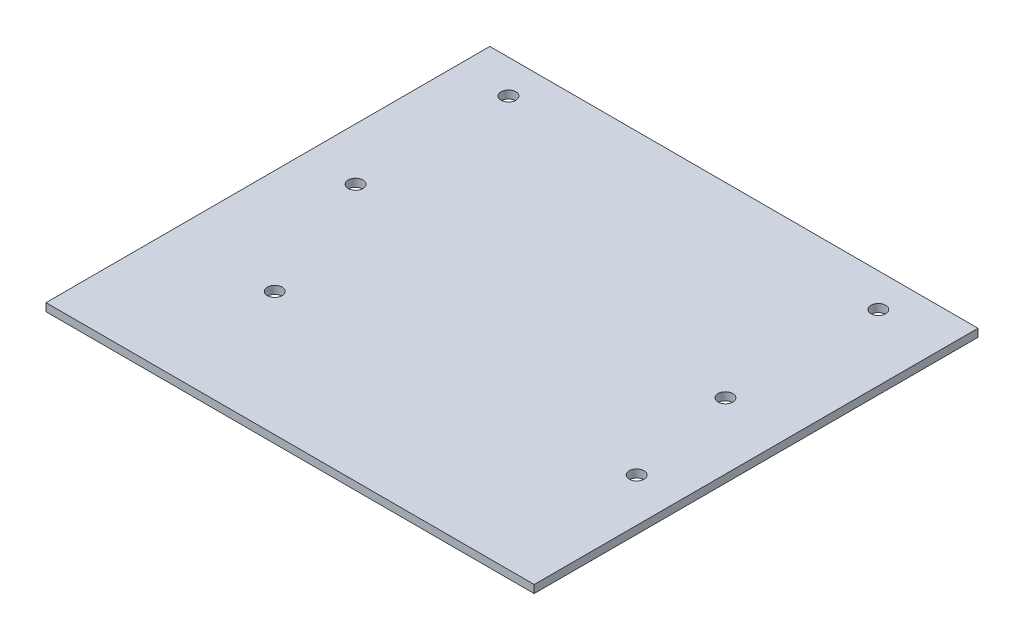
ISO-10303-21;
HEADER;
FILE_DESCRIPTION(('STEP AP214'),'2;1');
FILE_NAME('part.step','',(''),(''),'','','');
FILE_SCHEMA(('AUTOMOTIVE_DESIGN { 1 0 10303 214 1 1 1 1 }'));
ENDSEC;
DATA;
#1=APPLICATION_CONTEXT('core data for automotive mechanical design processes');
#2=APPLICATION_PROTOCOL_DEFINITION('international standard','automotive_design',2000,#1);
#3=PRODUCT_CONTEXT('',#1,'mechanical');
#4=PRODUCT('Part','Part','',(#3));
#5=PRODUCT_RELATED_PRODUCT_CATEGORY('part','',(#4));
#6=PRODUCT_DEFINITION_FORMATION('','',#4);
#7=PRODUCT_DEFINITION_CONTEXT('part definition',#1,'design');
#8=PRODUCT_DEFINITION('design','',#6,#7);
#9=PRODUCT_DEFINITION_SHAPE('','',#8);
#10=(LENGTH_UNIT() NAMED_UNIT(*) SI_UNIT(.MILLI.,.METRE.));
#11=(NAMED_UNIT(*) PLANE_ANGLE_UNIT() SI_UNIT($,.RADIAN.));
#12=(NAMED_UNIT(*) SI_UNIT($,.STERADIAN.) SOLID_ANGLE_UNIT());
#13=UNCERTAINTY_MEASURE_WITH_UNIT(LENGTH_MEASURE(1.E-05),#10,'distance_accuracy_value','');
#14=(GEOMETRIC_REPRESENTATION_CONTEXT(3) GLOBAL_UNCERTAINTY_ASSIGNED_CONTEXT((#13)) GLOBAL_UNIT_ASSIGNED_CONTEXT((#10,
#11,#12)) REPRESENTATION_CONTEXT('',''));
#15=CARTESIAN_POINT('',(0.,0.,0.));
#16=DIRECTION('',(0.,0.,1.));
#17=DIRECTION('',(1.,0.,0.));
#18=AXIS2_PLACEMENT_3D('',#15,#16,#17);
#19=CARTESIAN_POINT('',(0.,1.6,0.));
#20=DIRECTION('',(0.,-1.,0.));
#21=DIRECTION('',(0.,0.,-1.));
#22=AXIS2_PLACEMENT_3D('',#19,#20,#21);
#23=PLANE('',#22);
#24=DIRECTION('',(0.,0.,1.));
#25=VECTOR('',#24,1.);
#26=CARTESIAN_POINT('',(0.,1.6,0.));
#27=LINE('',#26,#25);
#28=CARTESIAN_POINT('',(0.,1.6,-90.));
#29=VERTEX_POINT('',#28);
#30=CARTESIAN_POINT('',(0.,1.6,0.));
#31=VERTEX_POINT('',#30);
#32=EDGE_CURVE('E87',#29,#31,#27,.T.);
#33=ORIENTED_EDGE('',*,*,#32,.T.);
#34=DIRECTION('',(1.,0.,0.));
#35=VECTOR('',#34,1.);
#36=CARTESIAN_POINT('',(0.,1.6,0.));
#37=LINE('',#36,#35);
#38=CARTESIAN_POINT('',(99.,1.6,0.));
#39=VERTEX_POINT('',#38);
#40=EDGE_CURVE('E82',#31,#39,#37,.T.);
#41=ORIENTED_EDGE('',*,*,#40,.T.);
#42=DIRECTION('',(0.,0.,-1.));
#43=VECTOR('',#42,1.);
#44=CARTESIAN_POINT('',(99.,1.6,0.));
#45=LINE('',#44,#43);
#46=CARTESIAN_POINT('',(99.,1.6,-90.));
#47=VERTEX_POINT('',#46);
#48=EDGE_CURVE('E85',#39,#47,#45,.T.);
#49=ORIENTED_EDGE('',*,*,#48,.T.);
#50=DIRECTION('',(-1.,0.,0.));
#51=VECTOR('',#50,1.);
#52=CARTESIAN_POINT('',(0.,1.6,-90.));
#53=LINE('',#52,#51);
#54=EDGE_CURVE('E52',#47,#29,#53,.T.);
#55=ORIENTED_EDGE('',*,*,#54,.T.);
#56=EDGE_LOOP('',(#33,#41,#49,#55));
#57=FACE_BOUND('',#56,.T.);
#58=CARTESIAN_POINT('',(10.5995733333333,1.6,-83.1801861351435));
#59=DIRECTION('',(0.,1.,0.));
#60=DIRECTION('',(0.,0.,1.));
#61=AXIS2_PLACEMENT_3D('',#58,#59,#60);
#62=CIRCLE('',#61,1.5);
#63=CARTESIAN_POINT('',(10.5995733333333,1.6,-81.6801861351435));
#64=VERTEX_POINT('',#63);
#65=EDGE_CURVE('E102',#64,#64,#62,.T.);
#66=ORIENTED_EDGE('',*,*,#65,.F.);
#67=EDGE_LOOP('',(#66));
#68=FACE_BOUND('',#67,.T.);
#69=CARTESIAN_POINT('',(85.5995733333333,1.6,-83.1801861351435));
#70=DIRECTION('',(0.,1.,0.));
#71=DIRECTION('',(0.,0.,1.));
#72=AXIS2_PLACEMENT_3D('',#69,#70,#71);
#73=CIRCLE('',#72,1.5);
#74=CARTESIAN_POINT('',(85.5995733333333,1.6,-81.6801861351435));
#75=VERTEX_POINT('',#74);
#76=EDGE_CURVE('E117',#75,#75,#73,.T.);
#77=ORIENTED_EDGE('',*,*,#76,.F.);
#78=EDGE_LOOP('',(#77));
#79=FACE_BOUND('',#78,.T.);
#80=CARTESIAN_POINT('',(10.5995733333333,1.6,-52.1801861351435));
#81=DIRECTION('',(0.,1.,0.));
#82=DIRECTION('',(0.,0.,1.));
#83=AXIS2_PLACEMENT_3D('',#80,#81,#82);
#84=CIRCLE('',#83,1.5);
#85=CARTESIAN_POINT('',(10.5995733333333,1.6,-50.6801861351435));
#86=VERTEX_POINT('',#85);
#87=EDGE_CURVE('E123',#86,#86,#84,.T.);
#88=ORIENTED_EDGE('',*,*,#87,.F.);
#89=EDGE_LOOP('',(#88));
#90=FACE_BOUND('',#89,.T.);
#91=CARTESIAN_POINT('',(85.5995733333333,1.6,-52.1801861351435));
#92=DIRECTION('',(0.,1.,0.));
#93=DIRECTION('',(0.,0.,1.));
#94=AXIS2_PLACEMENT_3D('',#91,#92,#93);
#95=CIRCLE('',#94,1.5);
#96=CARTESIAN_POINT('',(85.5995733333333,1.6,-50.6801861351435));
#97=VERTEX_POINT('',#96);
#98=EDGE_CURVE('E129',#97,#97,#95,.T.);
#99=ORIENTED_EDGE('',*,*,#98,.F.);
#100=EDGE_LOOP('',(#99));
#101=FACE_BOUND('',#100,.T.);
#102=CARTESIAN_POINT('',(21.2194612407166,1.6,-25.1699564094523));
#103=DIRECTION('',(0.,1.,0.));
#104=DIRECTION('',(0.,0.,1.));
#105=AXIS2_PLACEMENT_3D('',#102,#103,#104);
#106=CIRCLE('',#105,1.5);
#107=CARTESIAN_POINT('',(21.2194612407166,1.6,-23.6699564094523));
#108=VERTEX_POINT('',#107);
#109=EDGE_CURVE('E135',#108,#108,#106,.T.);
#110=ORIENTED_EDGE('',*,*,#109,.F.);
#111=EDGE_LOOP('',(#110));
#112=FACE_BOUND('',#111,.T.);
#113=CARTESIAN_POINT('',(90.1538087845677,1.6,-29.622324790266));
#114=DIRECTION('',(0.,1.,0.));
#115=DIRECTION('',(0.,0.,1.));
#116=AXIS2_PLACEMENT_3D('',#113,#114,#115);
#117=CIRCLE('',#116,1.5);
#118=CARTESIAN_POINT('',(90.1538087845677,1.6,-28.122324790266));
#119=VERTEX_POINT('',#118);
#120=EDGE_CURVE('E141',#119,#119,#117,.T.);
#121=ORIENTED_EDGE('',*,*,#120,.F.);
#122=EDGE_LOOP('',(#121));
#123=FACE_BOUND('',#122,.T.);
#124=ADVANCED_FACE('F35',(#57,#68,#79,#90,#101,#112,#123),#23,.F.);
#125=CARTESIAN_POINT('',(0.,0.,0.));
#126=DIRECTION('',(0.,-1.,0.));
#127=DIRECTION('',(0.,0.,-1.));
#128=AXIS2_PLACEMENT_3D('',#125,#126,#127);
#129=PLANE('',#128);
#130=CARTESIAN_POINT('',(21.2194612407166,0.,-25.1699564094523));
#131=DIRECTION('',(0.,1.,0.));
#132=DIRECTION('',(0.,0.,1.));
#133=AXIS2_PLACEMENT_3D('',#130,#131,#132);
#134=CIRCLE('',#133,1.5);
#135=CARTESIAN_POINT('',(21.2194612407166,0.,-23.6699564094523));
#136=VERTEX_POINT('',#135);
#137=EDGE_CURVE('E138',#136,#136,#134,.T.);
#138=ORIENTED_EDGE('',*,*,#137,.T.);
#139=EDGE_LOOP('',(#138));
#140=FACE_BOUND('',#139,.T.);
#141=CARTESIAN_POINT('',(10.5995733333333,0.,-52.1801861351435));
#142=DIRECTION('',(0.,1.,0.));
#143=DIRECTION('',(0.,0.,1.));
#144=AXIS2_PLACEMENT_3D('',#141,#142,#143);
#145=CIRCLE('',#144,1.5);
#146=CARTESIAN_POINT('',(10.5995733333333,0.,-50.6801861351435));
#147=VERTEX_POINT('',#146);
#148=EDGE_CURVE('E126',#147,#147,#145,.T.);
#149=ORIENTED_EDGE('',*,*,#148,.T.);
#150=EDGE_LOOP('',(#149));
#151=FACE_BOUND('',#150,.T.);
#152=CARTESIAN_POINT('',(10.5995733333333,0.,-83.1801861351435));
#153=DIRECTION('',(0.,1.,0.));
#154=DIRECTION('',(0.,0.,1.));
#155=AXIS2_PLACEMENT_3D('',#152,#153,#154);
#156=CIRCLE('',#155,1.5);
#157=CARTESIAN_POINT('',(10.5995733333333,0.,-81.6801861351435));
#158=VERTEX_POINT('',#157);
#159=EDGE_CURVE('E114',#158,#158,#156,.T.);
#160=ORIENTED_EDGE('',*,*,#159,.T.);
#161=EDGE_LOOP('',(#160));
#162=FACE_BOUND('',#161,.T.);
#163=DIRECTION('',(0.,0.,1.));
#164=VECTOR('',#163,1.);
#165=CARTESIAN_POINT('',(0.,0.,0.));
#166=LINE('',#165,#164);
#167=CARTESIAN_POINT('',(0.,0.,-90.));
#168=VERTEX_POINT('',#167);
#169=CARTESIAN_POINT('',(0.,0.,0.));
#170=VERTEX_POINT('',#169);
#171=EDGE_CURVE('E99',#168,#170,#166,.T.);
#172=ORIENTED_EDGE('',*,*,#171,.F.);
#173=DIRECTION('',(-1.,0.,0.));
#174=VECTOR('',#173,1.);
#175=CARTESIAN_POINT('',(0.,0.,-90.));
#176=LINE('',#175,#174);
#177=CARTESIAN_POINT('',(99.,0.,-90.));
#178=VERTEX_POINT('',#177);
#179=EDGE_CURVE('E75',#178,#168,#176,.T.);
#180=ORIENTED_EDGE('',*,*,#179,.F.);
#181=DIRECTION('',(0.,0.,-1.));
#182=VECTOR('',#181,1.);
#183=CARTESIAN_POINT('',(99.,0.,0.));
#184=LINE('',#183,#182);
#185=CARTESIAN_POINT('',(99.,0.,0.));
#186=VERTEX_POINT('',#185);
#187=EDGE_CURVE('E69',#186,#178,#184,.T.);
#188=ORIENTED_EDGE('',*,*,#187,.F.);
#189=DIRECTION('',(1.,0.,0.));
#190=VECTOR('',#189,1.);
#191=CARTESIAN_POINT('',(0.,0.,0.));
#192=LINE('',#191,#190);
#193=EDGE_CURVE('E91',#170,#186,#192,.T.);
#194=ORIENTED_EDGE('',*,*,#193,.F.);
#195=EDGE_LOOP('',(#172,#180,#188,#194));
#196=FACE_BOUND('',#195,.T.);
#197=CARTESIAN_POINT('',(85.5995733333333,0.,-83.1801861351435));
#198=DIRECTION('',(0.,1.,0.));
#199=DIRECTION('',(0.,0.,1.));
#200=AXIS2_PLACEMENT_3D('',#197,#198,#199);
#201=CIRCLE('',#200,1.5);
#202=CARTESIAN_POINT('',(85.5995733333333,0.,-81.6801861351435));
#203=VERTEX_POINT('',#202);
#204=EDGE_CURVE('E120',#203,#203,#201,.T.);
#205=ORIENTED_EDGE('',*,*,#204,.T.);
#206=EDGE_LOOP('',(#205));
#207=FACE_BOUND('',#206,.T.);
#208=CARTESIAN_POINT('',(85.5995733333333,0.,-52.1801861351435));
#209=DIRECTION('',(0.,1.,0.));
#210=DIRECTION('',(0.,0.,1.));
#211=AXIS2_PLACEMENT_3D('',#208,#209,#210);
#212=CIRCLE('',#211,1.5);
#213=CARTESIAN_POINT('',(85.5995733333333,0.,-50.6801861351435));
#214=VERTEX_POINT('',#213);
#215=EDGE_CURVE('E132',#214,#214,#212,.T.);
#216=ORIENTED_EDGE('',*,*,#215,.T.);
#217=EDGE_LOOP('',(#216));
#218=FACE_BOUND('',#217,.T.);
#219=CARTESIAN_POINT('',(90.1538087845677,0.,-29.622324790266));
#220=DIRECTION('',(0.,1.,0.));
#221=DIRECTION('',(0.,0.,1.));
#222=AXIS2_PLACEMENT_3D('',#219,#220,#221);
#223=CIRCLE('',#222,1.5);
#224=CARTESIAN_POINT('',(90.1538087845677,0.,-28.122324790266));
#225=VERTEX_POINT('',#224);
#226=EDGE_CURVE('E144',#225,#225,#223,.T.);
#227=ORIENTED_EDGE('',*,*,#226,.T.);
#228=EDGE_LOOP('',(#227));
#229=FACE_BOUND('',#228,.T.);
#230=ADVANCED_FACE('F110',(#140,#151,#162,#196,#207,#218,#229),#129,.T.);
#231=CARTESIAN_POINT('',(0.,1.6,0.));
#232=DIRECTION('',(1.,0.,0.));
#233=DIRECTION('',(0.,0.,-1.));
#234=AXIS2_PLACEMENT_3D('',#231,#232,#233);
#235=PLANE('',#234);
#236=ORIENTED_EDGE('',*,*,#171,.T.);
#237=DIRECTION('',(0.,-1.,0.));
#238=VECTOR('',#237,1.);
#239=CARTESIAN_POINT('',(0.,1.6,0.));
#240=LINE('',#239,#238);
#241=EDGE_CURVE('E11',#31,#170,#240,.T.);
#242=ORIENTED_EDGE('',*,*,#241,.F.);
#243=ORIENTED_EDGE('',*,*,#32,.F.);
#244=DIRECTION('',(0.,-1.,0.));
#245=VECTOR('',#244,1.);
#246=CARTESIAN_POINT('',(0.,1.6,-90.));
#247=LINE('',#246,#245);
#248=EDGE_CURVE('E95',#29,#168,#247,.T.);
#249=ORIENTED_EDGE('',*,*,#248,.T.);
#250=EDGE_LOOP('',(#236,#242,#243,#249));
#251=FACE_BOUND('',#250,.T.);
#252=ADVANCED_FACE('F37',(#251),#235,.F.);
#253=CARTESIAN_POINT('',(0.,1.6,0.));
#254=DIRECTION('',(0.,0.,-1.));
#255=DIRECTION('',(-1.,0.,0.));
#256=AXIS2_PLACEMENT_3D('',#253,#254,#255);
#257=PLANE('',#256);
#258=ORIENTED_EDGE('',*,*,#193,.T.);
#259=DIRECTION('',(0.,-1.,0.));
#260=VECTOR('',#259,1.);
#261=CARTESIAN_POINT('',(99.,1.6,0.));
#262=LINE('',#261,#260);
#263=EDGE_CURVE('E44',#39,#186,#262,.T.);
#264=ORIENTED_EDGE('',*,*,#263,.F.);
#265=ORIENTED_EDGE('',*,*,#40,.F.);
#266=ORIENTED_EDGE('',*,*,#241,.T.);
#267=EDGE_LOOP('',(#258,#264,#265,#266));
#268=FACE_BOUND('',#267,.T.);
#269=ADVANCED_FACE('F90',(#268),#257,.F.);
#270=CARTESIAN_POINT('',(99.,1.6,0.));
#271=DIRECTION('',(-1.,0.,0.));
#272=DIRECTION('',(0.,0.,1.));
#273=AXIS2_PLACEMENT_3D('',#270,#271,#272);
#274=PLANE('',#273);
#275=ORIENTED_EDGE('',*,*,#187,.T.);
#276=DIRECTION('',(0.,-1.,0.));
#277=VECTOR('',#276,1.);
#278=CARTESIAN_POINT('',(99.,1.6,-90.));
#279=LINE('',#278,#277);
#280=EDGE_CURVE('E92',#47,#178,#279,.T.);
#281=ORIENTED_EDGE('',*,*,#280,.F.);
#282=ORIENTED_EDGE('',*,*,#48,.F.);
#283=ORIENTED_EDGE('',*,*,#263,.T.);
#284=EDGE_LOOP('',(#275,#281,#282,#283));
#285=FACE_BOUND('',#284,.T.);
#286=ADVANCED_FACE('F93',(#285),#274,.F.);
#287=CARTESIAN_POINT('',(0.,1.6,-90.));
#288=DIRECTION('',(0.,0.,1.));
#289=DIRECTION('',(1.,0.,0.));
#290=AXIS2_PLACEMENT_3D('',#287,#288,#289);
#291=PLANE('',#290);
#292=ORIENTED_EDGE('',*,*,#179,.T.);
#293=ORIENTED_EDGE('',*,*,#248,.F.);
#294=ORIENTED_EDGE('',*,*,#54,.F.);
#295=ORIENTED_EDGE('',*,*,#280,.T.);
#296=EDGE_LOOP('',(#292,#293,#294,#295));
#297=FACE_BOUND('',#296,.T.);
#298=ADVANCED_FACE('F107',(#297),#291,.F.);
#299=CARTESIAN_POINT('',(10.5995733333333,1.6,-83.1801861351435));
#300=DIRECTION('',(0.,-1.,0.));
#301=DIRECTION('',(0.,0.,-1.));
#302=AXIS2_PLACEMENT_3D('',#299,#300,#301);
#303=CYLINDRICAL_SURFACE('',#302,1.5);
#304=ORIENTED_EDGE('',*,*,#65,.T.);
#305=EDGE_LOOP('',(#304));
#306=FACE_BOUND('',#305,.T.);
#307=ORIENTED_EDGE('',*,*,#159,.F.);
#308=EDGE_LOOP('',(#307));
#309=FACE_BOUND('',#308,.T.);
#310=ADVANCED_FACE('F161',(#306,#309),#303,.F.);
#311=CARTESIAN_POINT('',(85.5995733333333,1.6,-83.1801861351435));
#312=DIRECTION('',(0.,-1.,0.));
#313=DIRECTION('',(0.,0.,-1.));
#314=AXIS2_PLACEMENT_3D('',#311,#312,#313);
#315=CYLINDRICAL_SURFACE('',#314,1.5);
#316=ORIENTED_EDGE('',*,*,#76,.T.);
#317=EDGE_LOOP('',(#316));
#318=FACE_BOUND('',#317,.T.);
#319=ORIENTED_EDGE('',*,*,#204,.F.);
#320=EDGE_LOOP('',(#319));
#321=FACE_BOUND('',#320,.T.);
#322=ADVANCED_FACE('F207',(#318,#321),#315,.F.);
#323=CARTESIAN_POINT('',(10.5995733333333,1.6,-52.1801861351435));
#324=DIRECTION('',(0.,-1.,0.));
#325=DIRECTION('',(0.,0.,-1.));
#326=AXIS2_PLACEMENT_3D('',#323,#324,#325);
#327=CYLINDRICAL_SURFACE('',#326,1.5);
#328=ORIENTED_EDGE('',*,*,#87,.T.);
#329=EDGE_LOOP('',(#328));
#330=FACE_BOUND('',#329,.T.);
#331=ORIENTED_EDGE('',*,*,#148,.F.);
#332=EDGE_LOOP('',(#331));
#333=FACE_BOUND('',#332,.T.);
#334=ADVANCED_FACE('F215',(#330,#333),#327,.F.);
#335=CARTESIAN_POINT('',(85.5995733333333,1.6,-52.1801861351435));
#336=DIRECTION('',(0.,-1.,0.));
#337=DIRECTION('',(0.,0.,-1.));
#338=AXIS2_PLACEMENT_3D('',#335,#336,#337);
#339=CYLINDRICAL_SURFACE('',#338,1.5);
#340=ORIENTED_EDGE('',*,*,#98,.T.);
#341=EDGE_LOOP('',(#340));
#342=FACE_BOUND('',#341,.T.);
#343=ORIENTED_EDGE('',*,*,#215,.F.);
#344=EDGE_LOOP('',(#343));
#345=FACE_BOUND('',#344,.T.);
#346=ADVANCED_FACE('F223',(#342,#345),#339,.F.);
#347=CARTESIAN_POINT('',(21.2194612407166,1.6,-25.1699564094523));
#348=DIRECTION('',(0.,-1.,0.));
#349=DIRECTION('',(0.,0.,-1.));
#350=AXIS2_PLACEMENT_3D('',#347,#348,#349);
#351=CYLINDRICAL_SURFACE('',#350,1.5);
#352=ORIENTED_EDGE('',*,*,#109,.T.);
#353=EDGE_LOOP('',(#352));
#354=FACE_BOUND('',#353,.T.);
#355=ORIENTED_EDGE('',*,*,#137,.F.);
#356=EDGE_LOOP('',(#355));
#357=FACE_BOUND('',#356,.T.);
#358=ADVANCED_FACE('F232',(#354,#357),#351,.F.);
#359=CARTESIAN_POINT('',(90.1538087845677,1.6,-29.622324790266));
#360=DIRECTION('',(0.,-1.,0.));
#361=DIRECTION('',(0.,0.,-1.));
#362=AXIS2_PLACEMENT_3D('',#359,#360,#361);
#363=CYLINDRICAL_SURFACE('',#362,1.5);
#364=ORIENTED_EDGE('',*,*,#120,.T.);
#365=EDGE_LOOP('',(#364));
#366=FACE_BOUND('',#365,.T.);
#367=ORIENTED_EDGE('',*,*,#226,.F.);
#368=EDGE_LOOP('',(#367));
#369=FACE_BOUND('',#368,.T.);
#370=ADVANCED_FACE('F150',(#366,#369),#363,.F.);
#371=CLOSED_SHELL('',(#124,#230,#252,#269,#286,#298,#310,#322,#334,#346,#358,#370));
#372=MANIFOLD_SOLID_BREP('B2',#371);
#373=ADVANCED_BREP_SHAPE_REPRESENTATION('',(#18,#372),#14);
#374=SHAPE_DEFINITION_REPRESENTATION(#9,#373);
ENDSEC;
END-ISO-10303-21;
